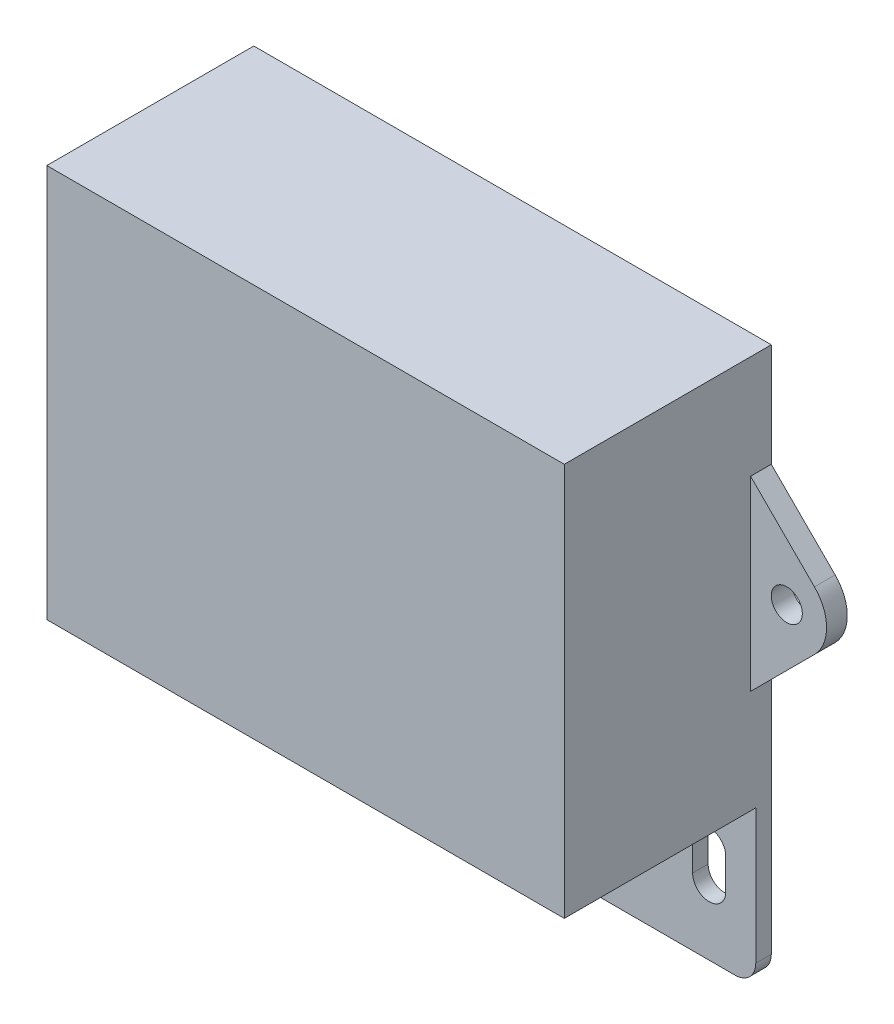
ISO-10303-21;
HEADER;
FILE_DESCRIPTION(('STEP AP214'),'2;1');
FILE_NAME('part.step','',(''),(''),'','','');
FILE_SCHEMA(('AUTOMOTIVE_DESIGN { 1 0 10303 214 1 1 1 1 }'));
ENDSEC;
DATA;
#1=APPLICATION_CONTEXT('core data for automotive mechanical design processes');
#2=APPLICATION_PROTOCOL_DEFINITION('international standard','automotive_design',2000,#1);
#3=PRODUCT_CONTEXT('',#1,'mechanical');
#4=PRODUCT('Part','Part','',(#3));
#5=PRODUCT_RELATED_PRODUCT_CATEGORY('part','',(#4));
#6=PRODUCT_DEFINITION_FORMATION('','',#4);
#7=PRODUCT_DEFINITION_CONTEXT('part definition',#1,'design');
#8=PRODUCT_DEFINITION('design','',#6,#7);
#9=PRODUCT_DEFINITION_SHAPE('','',#8);
#10=(LENGTH_UNIT() NAMED_UNIT(*) SI_UNIT(.MILLI.,.METRE.));
#11=(NAMED_UNIT(*) PLANE_ANGLE_UNIT() SI_UNIT($,.RADIAN.));
#12=(NAMED_UNIT(*) SI_UNIT($,.STERADIAN.) SOLID_ANGLE_UNIT());
#13=UNCERTAINTY_MEASURE_WITH_UNIT(LENGTH_MEASURE(1.E-05),#10,'distance_accuracy_value','');
#14=(GEOMETRIC_REPRESENTATION_CONTEXT(3) GLOBAL_UNCERTAINTY_ASSIGNED_CONTEXT((#13)) GLOBAL_UNIT_ASSIGNED_CONTEXT((#10,
#11,#12)) REPRESENTATION_CONTEXT('',''));
#15=CARTESIAN_POINT('',(0.,0.,0.));
#16=DIRECTION('',(0.,0.,1.));
#17=DIRECTION('',(1.,0.,0.));
#18=AXIS2_PLACEMENT_3D('',#15,#16,#17);
#19=CARTESIAN_POINT('',(-25.,-19.,20.));
#20=DIRECTION('',(0.,1.,0.));
#21=DIRECTION('',(0.,0.,1.));
#22=AXIS2_PLACEMENT_3D('',#19,#20,#21);
#23=PLANE('',#22);
#24=DIRECTION('',(-1.,0.,0.));
#25=VECTOR('',#24,1.);
#26=CARTESIAN_POINT('',(-25.,-19.,1.5));
#27=LINE('',#26,#25);
#28=CARTESIAN_POINT('',(25.,-19.,1.5));
#29=VERTEX_POINT('',#28);
#30=CARTESIAN_POINT('',(-25.,-19.,1.5));
#31=VERTEX_POINT('',#30);
#32=EDGE_CURVE('E295',#29,#31,#27,.T.);
#33=ORIENTED_EDGE('',*,*,#32,.F.);
#34=DIRECTION('',(0.,0.,-1.));
#35=VECTOR('',#34,1.);
#36=CARTESIAN_POINT('',(25.,-19.,20.));
#37=LINE('',#36,#35);
#38=CARTESIAN_POINT('',(25.,-19.,20.));
#39=VERTEX_POINT('',#38);
#40=EDGE_CURVE('E354',#39,#29,#37,.T.);
#41=ORIENTED_EDGE('',*,*,#40,.F.);
#42=DIRECTION('',(1.,0.,0.));
#43=VECTOR('',#42,1.);
#44=CARTESIAN_POINT('',(-25.,-19.,20.));
#45=LINE('',#44,#43);
#46=CARTESIAN_POINT('',(-25.,-19.,20.));
#47=VERTEX_POINT('',#46);
#48=EDGE_CURVE('E352',#47,#39,#45,.T.);
#49=ORIENTED_EDGE('',*,*,#48,.F.);
#50=DIRECTION('',(0.,0.,-1.));
#51=VECTOR('',#50,1.);
#52=CARTESIAN_POINT('',(-25.,-19.,20.));
#53=LINE('',#52,#51);
#54=EDGE_CURVE('E361',#47,#31,#53,.T.);
#55=ORIENTED_EDGE('',*,*,#54,.T.);
#56=EDGE_LOOP('',(#33,#41,#49,#55));
#57=FACE_BOUND('',#56,.T.);
#58=ADVANCED_FACE('F39',(#57),#23,.F.);
#59=CARTESIAN_POINT('',(25.,-19.,20.));
#60=DIRECTION('',(-1.,0.,0.));
#61=DIRECTION('',(0.,0.,1.));
#62=AXIS2_PLACEMENT_3D('',#59,#60,#61);
#63=PLANE('',#62);
#64=DIRECTION('',(0.,1.,0.));
#65=VECTOR('',#64,1.);
#66=CARTESIAN_POINT('',(25.,-19.,0.));
#67=LINE('',#66,#65);
#68=CARTESIAN_POINT('',(25.,-32.,0.));
#69=VERTEX_POINT('',#68);
#70=CARTESIAN_POINT('',(25.,-9.,0.));
#71=VERTEX_POINT('',#70);
#72=EDGE_CURVE('E355',#69,#71,#67,.T.);
#73=ORIENTED_EDGE('',*,*,#72,.T.);
#74=DIRECTION('',(0.,0.,-1.));
#75=VECTOR('',#74,1.);
#76=CARTESIAN_POINT('',(25.,-9.,2.));
#77=LINE('',#76,#75);
#78=CARTESIAN_POINT('',(25.,-9.,2.));
#79=VERTEX_POINT('',#78);
#80=EDGE_CURVE('E262',#79,#71,#77,.T.);
#81=ORIENTED_EDGE('',*,*,#80,.F.);
#82=DIRECTION('',(0.,1.,0.));
#83=VECTOR('',#82,1.);
#84=CARTESIAN_POINT('',(25.,9.,2.));
#85=LINE('',#84,#83);
#86=CARTESIAN_POINT('',(25.,9.,2.));
#87=VERTEX_POINT('',#86);
#88=EDGE_CURVE('E251',#79,#87,#85,.T.);
#89=ORIENTED_EDGE('',*,*,#88,.T.);
#90=DIRECTION('',(0.,0.,-1.));
#91=VECTOR('',#90,1.);
#92=CARTESIAN_POINT('',(25.,9.,2.));
#93=LINE('',#92,#91);
#94=CARTESIAN_POINT('',(25.,9.,0.));
#95=VERTEX_POINT('',#94);
#96=EDGE_CURVE('E258',#87,#95,#93,.T.);
#97=ORIENTED_EDGE('',*,*,#96,.T.);
#98=CARTESIAN_POINT('',(25.,19.,0.));
#99=VERTEX_POINT('',#98);
#100=EDGE_CURVE('E344',#95,#99,#67,.T.);
#101=ORIENTED_EDGE('',*,*,#100,.T.);
#102=DIRECTION('',(0.,0.,-1.));
#103=VECTOR('',#102,1.);
#104=CARTESIAN_POINT('',(25.,19.,20.));
#105=LINE('',#104,#103);
#106=CARTESIAN_POINT('',(25.,19.,20.));
#107=VERTEX_POINT('',#106);
#108=EDGE_CURVE('E367',#107,#99,#105,.T.);
#109=ORIENTED_EDGE('',*,*,#108,.F.);
#110=DIRECTION('',(0.,1.,0.));
#111=VECTOR('',#110,1.);
#112=CARTESIAN_POINT('',(25.,-19.,20.));
#113=LINE('',#112,#111);
#114=EDGE_CURVE('E345',#39,#107,#113,.T.);
#115=ORIENTED_EDGE('',*,*,#114,.F.);
#116=ORIENTED_EDGE('',*,*,#40,.T.);
#117=DIRECTION('',(0.,1.,0.));
#118=VECTOR('',#117,1.);
#119=CARTESIAN_POINT('',(25.,-34.,1.50000000000001));
#120=LINE('',#119,#118);
#121=CARTESIAN_POINT('',(25.,-32.,1.50000000000001));
#122=VERTEX_POINT('',#121);
#123=EDGE_CURVE('E342',#122,#29,#120,.T.);
#124=ORIENTED_EDGE('',*,*,#123,.F.);
#125=DIRECTION('',(0.,0.,1.));
#126=VECTOR('',#125,1.);
#127=CARTESIAN_POINT('',(25.,-32.,0.));
#128=LINE('',#127,#126);
#129=EDGE_CURVE('E380',#122,#69,#128,.F.);
#130=ORIENTED_EDGE('',*,*,#129,.T.);
#131=EDGE_LOOP('',(#73,#81,#89,#97,#101,#109,#115,#116,#124,#130));
#132=FACE_BOUND('',#131,.T.);
#133=ADVANCED_FACE('F408',(#132),#63,.F.);
#134=CARTESIAN_POINT('',(-25.,19.,20.));
#135=DIRECTION('',(0.,-1.,0.));
#136=DIRECTION('',(0.,0.,-1.));
#137=AXIS2_PLACEMENT_3D('',#134,#135,#136);
#138=PLANE('',#137);
#139=DIRECTION('',(-1.,0.,0.));
#140=VECTOR('',#139,1.);
#141=CARTESIAN_POINT('',(-25.,19.,0.));
#142=LINE('',#141,#140);
#143=CARTESIAN_POINT('',(-25.,19.,0.));
#144=VERTEX_POINT('',#143);
#145=EDGE_CURVE('E210',#99,#144,#142,.T.);
#146=ORIENTED_EDGE('',*,*,#145,.T.);
#147=DIRECTION('',(0.,0.,-1.));
#148=VECTOR('',#147,1.);
#149=CARTESIAN_POINT('',(-25.,19.,20.));
#150=LINE('',#149,#148);
#151=CARTESIAN_POINT('',(-25.,19.,20.));
#152=VERTEX_POINT('',#151);
#153=EDGE_CURVE('E364',#152,#144,#150,.T.);
#154=ORIENTED_EDGE('',*,*,#153,.F.);
#155=DIRECTION('',(-1.,0.,0.));
#156=VECTOR('',#155,1.);
#157=CARTESIAN_POINT('',(-25.,19.,20.));
#158=LINE('',#157,#156);
#159=EDGE_CURVE('E348',#107,#152,#158,.T.);
#160=ORIENTED_EDGE('',*,*,#159,.F.);
#161=ORIENTED_EDGE('',*,*,#108,.T.);
#162=EDGE_LOOP('',(#146,#154,#160,#161));
#163=FACE_BOUND('',#162,.T.);
#164=ADVANCED_FACE('F427',(#163),#138,.F.);
#165=CARTESIAN_POINT('',(-25.,-19.,20.));
#166=DIRECTION('',(1.,0.,0.));
#167=DIRECTION('',(0.,0.,-1.));
#168=AXIS2_PLACEMENT_3D('',#165,#166,#167);
#169=PLANE('',#168);
#170=DIRECTION('',(0.,-1.,0.));
#171=VECTOR('',#170,1.);
#172=CARTESIAN_POINT('',(-25.,-19.,0.));
#173=LINE('',#172,#171);
#174=CARTESIAN_POINT('',(-25.,9.,0.));
#175=VERTEX_POINT('',#174);
#176=EDGE_CURVE('E209',#144,#175,#173,.T.);
#177=ORIENTED_EDGE('',*,*,#176,.T.);
#178=DIRECTION('',(0.,0.,-1.));
#179=VECTOR('',#178,1.);
#180=CARTESIAN_POINT('',(-25.,9.,2.));
#181=LINE('',#180,#179);
#182=CARTESIAN_POINT('',(-25.,9.,2.));
#183=VERTEX_POINT('',#182);
#184=EDGE_CURVE('E223',#183,#175,#181,.T.);
#185=ORIENTED_EDGE('',*,*,#184,.F.);
#186=DIRECTION('',(0.,-1.,0.));
#187=VECTOR('',#186,1.);
#188=CARTESIAN_POINT('',(-25.,9.,2.));
#189=LINE('',#188,#187);
#190=CARTESIAN_POINT('',(-25.,-9.,2.));
#191=VERTEX_POINT('',#190);
#192=EDGE_CURVE('E218',#183,#191,#189,.T.);
#193=ORIENTED_EDGE('',*,*,#192,.T.);
#194=DIRECTION('',(0.,0.,-1.));
#195=VECTOR('',#194,1.);
#196=CARTESIAN_POINT('',(-25.,-9.,2.));
#197=LINE('',#196,#195);
#198=CARTESIAN_POINT('',(-25.,-9.,0.));
#199=VERTEX_POINT('',#198);
#200=EDGE_CURVE('E213',#191,#199,#197,.T.);
#201=ORIENTED_EDGE('',*,*,#200,.T.);
#202=CARTESIAN_POINT('',(-25.,-32.,0.));
#203=VERTEX_POINT('',#202);
#204=EDGE_CURVE('E199',#199,#203,#173,.T.);
#205=ORIENTED_EDGE('',*,*,#204,.T.);
#206=DIRECTION('',(0.,0.,-1.));
#207=VECTOR('',#206,1.);
#208=CARTESIAN_POINT('',(-25.,-32.,1.5));
#209=LINE('',#208,#207);
#210=CARTESIAN_POINT('',(-25.,-32.,1.5));
#211=VERTEX_POINT('',#210);
#212=EDGE_CURVE('E385',#203,#211,#209,.F.);
#213=ORIENTED_EDGE('',*,*,#212,.T.);
#214=DIRECTION('',(0.,1.,0.));
#215=VECTOR('',#214,1.);
#216=CARTESIAN_POINT('',(-25.,-34.,1.5));
#217=LINE('',#216,#215);
#218=EDGE_CURVE('E338',#211,#31,#217,.T.);
#219=ORIENTED_EDGE('',*,*,#218,.T.);
#220=ORIENTED_EDGE('',*,*,#54,.F.);
#221=DIRECTION('',(0.,-1.,0.));
#222=VECTOR('',#221,1.);
#223=CARTESIAN_POINT('',(-25.,-19.,20.));
#224=LINE('',#223,#222);
#225=EDGE_CURVE('E350',#152,#47,#224,.T.);
#226=ORIENTED_EDGE('',*,*,#225,.F.);
#227=ORIENTED_EDGE('',*,*,#153,.T.);
#228=EDGE_LOOP('',(#177,#185,#193,#201,#205,#213,#219,#220,#226,#227));
#229=FACE_BOUND('',#228,.T.);
#230=ADVANCED_FACE('F215',(#229),#169,.F.);
#231=CARTESIAN_POINT('',(0.,0.,20.));
#232=DIRECTION('',(0.,0.,-1.));
#233=DIRECTION('',(-1.,0.,0.));
#234=AXIS2_PLACEMENT_3D('',#231,#232,#233);
#235=PLANE('',#234);
#236=ORIENTED_EDGE('',*,*,#114,.T.);
#237=ORIENTED_EDGE('',*,*,#159,.T.);
#238=ORIENTED_EDGE('',*,*,#225,.T.);
#239=ORIENTED_EDGE('',*,*,#48,.T.);
#240=EDGE_LOOP('',(#236,#237,#238,#239));
#241=FACE_BOUND('',#240,.T.);
#242=ADVANCED_FACE('F435',(#241),#235,.F.);
#243=CARTESIAN_POINT('',(0.,0.,0.));
#244=DIRECTION('',(0.,0.,-1.));
#245=DIRECTION('',(-1.,0.,0.));
#246=AXIS2_PLACEMENT_3D('',#243,#244,#245);
#247=PLANE('',#246);
#248=CARTESIAN_POINT('',(-20.5,-27.5,0.));
#249=DIRECTION('',(0.,0.,1.));
#250=DIRECTION('',(1.,0.,0.));
#251=AXIS2_PLACEMENT_3D('',#248,#249,#250);
#252=CIRCLE('',#251,1.6);
#253=CARTESIAN_POINT('',(-22.1,-27.5,0.));
#254=VERTEX_POINT('',#253);
#255=CARTESIAN_POINT('',(-18.9,-27.5,0.));
#256=VERTEX_POINT('',#255);
#257=EDGE_CURVE('E268',#254,#256,#252,.T.);
#258=ORIENTED_EDGE('',*,*,#257,.T.);
#259=DIRECTION('',(0.,1.,0.));
#260=VECTOR('',#259,1.);
#261=CARTESIAN_POINT('',(-18.9,-24.5,0.));
#262=LINE('',#261,#260);
#263=CARTESIAN_POINT('',(-18.9,-24.5,0.));
#264=VERTEX_POINT('',#263);
#265=EDGE_CURVE('E271',#256,#264,#262,.T.);
#266=ORIENTED_EDGE('',*,*,#265,.T.);
#267=CARTESIAN_POINT('',(-20.5,-24.5,0.));
#268=DIRECTION('',(0.,0.,1.));
#269=DIRECTION('',(1.,0.,0.));
#270=AXIS2_PLACEMENT_3D('',#267,#268,#269);
#271=CIRCLE('',#270,1.6);
#272=CARTESIAN_POINT('',(-22.1,-24.5,0.));
#273=VERTEX_POINT('',#272);
#274=EDGE_CURVE('E275',#264,#273,#271,.T.);
#275=ORIENTED_EDGE('',*,*,#274,.T.);
#276=DIRECTION('',(0.,-1.,0.));
#277=VECTOR('',#276,1.);
#278=CARTESIAN_POINT('',(-22.1,-24.5,0.));
#279=LINE('',#278,#277);
#280=EDGE_CURVE('E278',#273,#254,#279,.T.);
#281=ORIENTED_EDGE('',*,*,#280,.T.);
#282=EDGE_LOOP('',(#258,#266,#275,#281));
#283=FACE_BOUND('',#282,.T.);
#284=CARTESIAN_POINT('',(20.5,-27.5,0.));
#285=DIRECTION('',(0.,0.,1.));
#286=DIRECTION('',(1.,0.,0.));
#287=AXIS2_PLACEMENT_3D('',#284,#285,#286);
#288=CIRCLE('',#287,1.6);
#289=CARTESIAN_POINT('',(18.9,-27.5,0.));
#290=VERTEX_POINT('',#289);
#291=CARTESIAN_POINT('',(22.1,-27.5,0.));
#292=VERTEX_POINT('',#291);
#293=EDGE_CURVE('E315',#290,#292,#288,.T.);
#294=ORIENTED_EDGE('',*,*,#293,.T.);
#295=DIRECTION('',(0.,1.,0.));
#296=VECTOR('',#295,1.);
#297=CARTESIAN_POINT('',(22.1,-24.5,0.));
#298=LINE('',#297,#296);
#299=CARTESIAN_POINT('',(22.1,-24.5,0.));
#300=VERTEX_POINT('',#299);
#301=EDGE_CURVE('E327',#292,#300,#298,.T.);
#302=ORIENTED_EDGE('',*,*,#301,.T.);
#303=CARTESIAN_POINT('',(20.5,-24.5,0.));
#304=DIRECTION('',(0.,0.,1.));
#305=DIRECTION('',(1.,0.,0.));
#306=AXIS2_PLACEMENT_3D('',#303,#304,#305);
#307=CIRCLE('',#306,1.6);
#308=CARTESIAN_POINT('',(18.9,-24.5,0.));
#309=VERTEX_POINT('',#308);
#310=EDGE_CURVE('E324',#300,#309,#307,.T.);
#311=ORIENTED_EDGE('',*,*,#310,.T.);
#312=DIRECTION('',(0.,-1.,0.));
#313=VECTOR('',#312,1.);
#314=CARTESIAN_POINT('',(18.9,-24.5,0.));
#315=LINE('',#314,#313);
#316=EDGE_CURVE('E305',#309,#290,#315,.T.);
#317=ORIENTED_EDGE('',*,*,#316,.T.);
#318=EDGE_LOOP('',(#294,#302,#311,#317));
#319=FACE_BOUND('',#318,.T.);
#320=DIRECTION('',(-0.707106781186547,0.707106781186548,0.));
#321=VECTOR('',#320,1.);
#322=CARTESIAN_POINT('',(-25.,-9.,0.));
#323=LINE('',#322,#321);
#324=CARTESIAN_POINT('',(-31.1715728752538,-2.82842712474619,0.));
#325=VERTEX_POINT('',#324);
#326=EDGE_CURVE('E204',#199,#325,#323,.T.);
#327=ORIENTED_EDGE('',*,*,#326,.T.);
#328=CARTESIAN_POINT('',(-28.3431457505076,0.,0.));
#329=DIRECTION('',(0.,0.,-1.));
#330=DIRECTION('',(-1.,0.,0.));
#331=AXIS2_PLACEMENT_3D('',#328,#329,#330);
#332=CIRCLE('',#331,4.);
#333=CARTESIAN_POINT('',(-31.1715728752538,2.82842712474619,0.));
#334=VERTEX_POINT('',#333);
#335=EDGE_CURVE('E390',#325,#334,#332,.T.);
#336=ORIENTED_EDGE('',*,*,#335,.T.);
#337=DIRECTION('',(0.707106781186547,0.707106781186547,0.));
#338=VECTOR('',#337,1.);
#339=CARTESIAN_POINT('',(-34.,0.,0.));
#340=LINE('',#339,#338);
#341=EDGE_CURVE('E230',#334,#175,#340,.T.);
#342=ORIENTED_EDGE('',*,*,#341,.T.);
#343=ORIENTED_EDGE('',*,*,#176,.F.);
#344=ORIENTED_EDGE('',*,*,#145,.F.);
#345=ORIENTED_EDGE('',*,*,#100,.F.);
#346=DIRECTION('',(0.707106781186547,-0.707106781186548,0.));
#347=VECTOR('',#346,1.);
#348=CARTESIAN_POINT('',(25.,9.,0.));
#349=LINE('',#348,#347);
#350=CARTESIAN_POINT('',(31.1715728752538,2.82842712474619,0.));
#351=VERTEX_POINT('',#350);
#352=EDGE_CURVE('E248',#95,#351,#349,.T.);
#353=ORIENTED_EDGE('',*,*,#352,.T.);
#354=CARTESIAN_POINT('',(28.3431457505076,0.,0.));
#355=DIRECTION('',(0.,0.,-1.));
#356=DIRECTION('',(-1.,0.,0.));
#357=AXIS2_PLACEMENT_3D('',#354,#355,#356);
#358=CIRCLE('',#357,4.);
#359=CARTESIAN_POINT('',(31.1715728752538,-2.82842712474619,0.));
#360=VERTEX_POINT('',#359);
#361=EDGE_CURVE('E388',#351,#360,#358,.T.);
#362=ORIENTED_EDGE('',*,*,#361,.T.);
#363=DIRECTION('',(-0.707106781186547,-0.707106781186548,0.));
#364=VECTOR('',#363,1.);
#365=CARTESIAN_POINT('',(34.,0.,0.));
#366=LINE('',#365,#364);
#367=EDGE_CURVE('E254',#360,#71,#366,.T.);
#368=ORIENTED_EDGE('',*,*,#367,.T.);
#369=ORIENTED_EDGE('',*,*,#72,.F.);
#370=CARTESIAN_POINT('',(23.,-32.,0.));
#371=DIRECTION('',(0.,0.,-1.));
#372=DIRECTION('',(-1.,0.,0.));
#373=AXIS2_PLACEMENT_3D('',#370,#371,#372);
#374=CIRCLE('',#373,2.);
#375=CARTESIAN_POINT('',(23.,-34.,0.));
#376=VERTEX_POINT('',#375);
#377=EDGE_CURVE('E383',#69,#376,#374,.T.);
#378=ORIENTED_EDGE('',*,*,#377,.T.);
#379=DIRECTION('',(1.,0.,0.));
#380=VECTOR('',#379,1.);
#381=CARTESIAN_POINT('',(-25.,-34.,0.));
#382=LINE('',#381,#380);
#383=CARTESIAN_POINT('',(-23.,-34.,0.));
#384=VERTEX_POINT('',#383);
#385=EDGE_CURVE('E332',#384,#376,#382,.T.);
#386=ORIENTED_EDGE('',*,*,#385,.F.);
#387=CARTESIAN_POINT('',(-23.,-32.,0.));
#388=DIRECTION('',(0.,0.,-1.));
#389=DIRECTION('',(-1.,0.,0.));
#390=AXIS2_PLACEMENT_3D('',#387,#388,#389);
#391=CIRCLE('',#390,2.);
#392=EDGE_CURVE('E206',#384,#203,#391,.T.);
#393=ORIENTED_EDGE('',*,*,#392,.T.);
#394=ORIENTED_EDGE('',*,*,#204,.F.);
#395=EDGE_LOOP('',(#327,#336,#342,#343,#344,#345,#353,#362,#368,#369,#378,#386,#393,#394));
#396=FACE_BOUND('',#395,.T.);
#397=CARTESIAN_POINT('',(28.5,0.,0.));
#398=DIRECTION('',(0.,0.,-1.));
#399=DIRECTION('',(-1.,0.,0.));
#400=AXIS2_PLACEMENT_3D('',#397,#398,#399);
#401=CIRCLE('',#400,1.5);
#402=CARTESIAN_POINT('',(27.,0.,0.));
#403=VERTEX_POINT('',#402);
#404=EDGE_CURVE('E243',#403,#403,#401,.T.);
#405=ORIENTED_EDGE('',*,*,#404,.F.);
#406=EDGE_LOOP('',(#405));
#407=FACE_BOUND('',#406,.T.);
#408=CARTESIAN_POINT('',(-28.5,0.,0.));
#409=DIRECTION('',(0.,0.,-1.));
#410=DIRECTION('',(-1.,0.,0.));
#411=AXIS2_PLACEMENT_3D('',#408,#409,#410);
#412=CIRCLE('',#411,1.5);
#413=CARTESIAN_POINT('',(-30.,0.,0.));
#414=VERTEX_POINT('',#413);
#415=EDGE_CURVE('E233',#414,#414,#412,.T.);
#416=ORIENTED_EDGE('',*,*,#415,.F.);
#417=EDGE_LOOP('',(#416));
#418=FACE_BOUND('',#417,.T.);
#419=ADVANCED_FACE('F201',(#283,#319,#396,#407,#418),#247,.T.);
#420=CARTESIAN_POINT('',(-25.,-34.,1.5));
#421=DIRECTION('',(0.,0.,-1.));
#422=DIRECTION('',(-1.,0.,0.));
#423=AXIS2_PLACEMENT_3D('',#420,#421,#422);
#424=PLANE('',#423);
#425=DIRECTION('',(0.,1.,0.));
#426=VECTOR('',#425,1.);
#427=CARTESIAN_POINT('',(-18.9,-24.5,1.5));
#428=LINE('',#427,#426);
#429=CARTESIAN_POINT('',(-18.9,-27.5,1.5));
#430=VERTEX_POINT('',#429);
#431=CARTESIAN_POINT('',(-18.9,-24.5,1.5));
#432=VERTEX_POINT('',#431);
#433=EDGE_CURVE('E284',#430,#432,#428,.T.);
#434=ORIENTED_EDGE('',*,*,#433,.F.);
#435=CARTESIAN_POINT('',(-20.5,-27.5,1.5));
#436=DIRECTION('',(0.,0.,1.));
#437=DIRECTION('',(1.,0.,0.));
#438=AXIS2_PLACEMENT_3D('',#435,#436,#437);
#439=CIRCLE('',#438,1.6);
#440=CARTESIAN_POINT('',(-22.1,-27.5,1.5));
#441=VERTEX_POINT('',#440);
#442=EDGE_CURVE('E282',#441,#430,#439,.T.);
#443=ORIENTED_EDGE('',*,*,#442,.F.);
#444=DIRECTION('',(0.,-1.,0.));
#445=VECTOR('',#444,1.);
#446=CARTESIAN_POINT('',(-22.1,-24.5,1.5));
#447=LINE('',#446,#445);
#448=CARTESIAN_POINT('',(-22.1,-24.5,1.5));
#449=VERTEX_POINT('',#448);
#450=EDGE_CURVE('E272',#449,#441,#447,.T.);
#451=ORIENTED_EDGE('',*,*,#450,.F.);
#452=CARTESIAN_POINT('',(-20.5,-24.5,1.5));
#453=DIRECTION('',(0.,0.,1.));
#454=DIRECTION('',(1.,0.,0.));
#455=AXIS2_PLACEMENT_3D('',#452,#453,#454);
#456=CIRCLE('',#455,1.6);
#457=EDGE_CURVE('E288',#432,#449,#456,.T.);
#458=ORIENTED_EDGE('',*,*,#457,.F.);
#459=EDGE_LOOP('',(#434,#443,#451,#458));
#460=FACE_BOUND('',#459,.T.);
#461=DIRECTION('',(0.,1.,0.));
#462=VECTOR('',#461,1.);
#463=CARTESIAN_POINT('',(22.1,-24.5,1.5));
#464=LINE('',#463,#462);
#465=CARTESIAN_POINT('',(22.1,-27.5,1.50000000000001));
#466=VERTEX_POINT('',#465);
#467=CARTESIAN_POINT('',(22.1,-24.5,1.5));
#468=VERTEX_POINT('',#467);
#469=EDGE_CURVE('E318',#466,#468,#464,.T.);
#470=ORIENTED_EDGE('',*,*,#469,.F.);
#471=CARTESIAN_POINT('',(20.5,-27.5,1.5));
#472=DIRECTION('',(0.,0.,1.));
#473=DIRECTION('',(1.,0.,0.));
#474=AXIS2_PLACEMENT_3D('',#471,#472,#473);
#475=CIRCLE('',#474,1.6);
#476=CARTESIAN_POINT('',(18.9,-27.5,1.5));
#477=VERTEX_POINT('',#476);
#478=EDGE_CURVE('E285',#477,#466,#475,.T.);
#479=ORIENTED_EDGE('',*,*,#478,.F.);
#480=DIRECTION('',(0.,-1.,0.));
#481=VECTOR('',#480,1.);
#482=CARTESIAN_POINT('',(18.9,-24.5,1.5));
#483=LINE('',#482,#481);
#484=CARTESIAN_POINT('',(18.9,-24.5,1.5));
#485=VERTEX_POINT('',#484);
#486=EDGE_CURVE('E311',#485,#477,#483,.T.);
#487=ORIENTED_EDGE('',*,*,#486,.F.);
#488=CARTESIAN_POINT('',(20.5,-24.5,1.5));
#489=DIRECTION('',(0.,0.,1.));
#490=DIRECTION('',(1.,0.,0.));
#491=AXIS2_PLACEMENT_3D('',#488,#489,#490);
#492=CIRCLE('',#491,1.6);
#493=EDGE_CURVE('E314',#468,#485,#492,.T.);
#494=ORIENTED_EDGE('',*,*,#493,.F.);
#495=EDGE_LOOP('',(#470,#479,#487,#494));
#496=FACE_BOUND('',#495,.T.);
#497=DIRECTION('',(-1.,0.,0.));
#498=VECTOR('',#497,1.);
#499=CARTESIAN_POINT('',(-25.,-34.,1.5));
#500=LINE('',#499,#498);
#501=CARTESIAN_POINT('',(23.,-34.,1.50000000000001));
#502=VERTEX_POINT('',#501);
#503=CARTESIAN_POINT('',(-23.,-34.,1.5));
#504=VERTEX_POINT('',#503);
#505=EDGE_CURVE('E335',#502,#504,#500,.T.);
#506=ORIENTED_EDGE('',*,*,#505,.F.);
#507=CARTESIAN_POINT('',(23.,-32.,1.50000000000001));
#508=DIRECTION('',(0.,0.,-1.));
#509=DIRECTION('',(-1.,0.,0.));
#510=AXIS2_PLACEMENT_3D('',#507,#508,#509);
#511=CIRCLE('',#510,2.);
#512=EDGE_CURVE('E378',#502,#122,#511,.F.);
#513=ORIENTED_EDGE('',*,*,#512,.T.);
#514=ORIENTED_EDGE('',*,*,#123,.T.);
#515=ORIENTED_EDGE('',*,*,#32,.T.);
#516=ORIENTED_EDGE('',*,*,#218,.F.);
#517=CARTESIAN_POINT('',(-23.,-32.,1.5));
#518=DIRECTION('',(0.,0.,-1.));
#519=DIRECTION('',(-1.,0.,0.));
#520=AXIS2_PLACEMENT_3D('',#517,#518,#519);
#521=CIRCLE('',#520,2.);
#522=EDGE_CURVE('E376',#211,#504,#521,.F.);
#523=ORIENTED_EDGE('',*,*,#522,.T.);
#524=EDGE_LOOP('',(#506,#513,#514,#515,#516,#523));
#525=FACE_BOUND('',#524,.T.);
#526=ADVANCED_FACE('F460',(#460,#496,#525),#424,.F.);
#527=CARTESIAN_POINT('',(0.,-34.,0.));
#528=DIRECTION('',(0.,-1.,0.));
#529=DIRECTION('',(0.,0.,-1.));
#530=AXIS2_PLACEMENT_3D('',#527,#528,#529);
#531=PLANE('',#530);
#532=ORIENTED_EDGE('',*,*,#385,.T.);
#533=DIRECTION('',(0.,0.,1.));
#534=VECTOR('',#533,1.);
#535=CARTESIAN_POINT('',(23.,-34.,1.50000000000001));
#536=LINE('',#535,#534);
#537=EDGE_CURVE('E373',#376,#502,#536,.T.);
#538=ORIENTED_EDGE('',*,*,#537,.T.);
#539=ORIENTED_EDGE('',*,*,#505,.T.);
#540=DIRECTION('',(0.,0.,-1.));
#541=VECTOR('',#540,1.);
#542=CARTESIAN_POINT('',(-23.,-34.,0.));
#543=LINE('',#542,#541);
#544=EDGE_CURVE('E370',#504,#384,#543,.T.);
#545=ORIENTED_EDGE('',*,*,#544,.T.);
#546=EDGE_LOOP('',(#532,#538,#539,#545));
#547=FACE_BOUND('',#546,.T.);
#548=ADVANCED_FACE('F443',(#547),#531,.T.);
#549=CARTESIAN_POINT('',(23.,-32.,0.));
#550=DIRECTION('',(0.,0.,-1.));
#551=DIRECTION('',(-1.,0.,0.));
#552=AXIS2_PLACEMENT_3D('',#549,#550,#551);
#553=CYLINDRICAL_SURFACE('',#552,2.);
#554=ORIENTED_EDGE('',*,*,#377,.F.);
#555=ORIENTED_EDGE('',*,*,#129,.F.);
#556=ORIENTED_EDGE('',*,*,#512,.F.);
#557=ORIENTED_EDGE('',*,*,#537,.F.);
#558=EDGE_LOOP('',(#554,#555,#556,#557));
#559=FACE_BOUND('',#558,.T.);
#560=ADVANCED_FACE('F439',(#559),#553,.T.);
#561=CARTESIAN_POINT('',(-23.,-32.,0.));
#562=DIRECTION('',(0.,0.,1.));
#563=DIRECTION('',(1.,0.,0.));
#564=AXIS2_PLACEMENT_3D('',#561,#562,#563);
#565=CYLINDRICAL_SURFACE('',#564,2.);
#566=ORIENTED_EDGE('',*,*,#522,.F.);
#567=ORIENTED_EDGE('',*,*,#212,.F.);
#568=ORIENTED_EDGE('',*,*,#392,.F.);
#569=ORIENTED_EDGE('',*,*,#544,.F.);
#570=EDGE_LOOP('',(#566,#567,#568,#569));
#571=FACE_BOUND('',#570,.T.);
#572=ADVANCED_FACE('F442',(#571),#565,.T.);
#573=CARTESIAN_POINT('',(20.5,-27.5,0.));
#574=DIRECTION('',(0.,0.,1.));
#575=DIRECTION('',(1.,0.,0.));
#576=AXIS2_PLACEMENT_3D('',#573,#574,#575);
#577=CYLINDRICAL_SURFACE('',#576,1.6);
#578=ORIENTED_EDGE('',*,*,#478,.T.);
#579=DIRECTION('',(0.,0.,1.));
#580=VECTOR('',#579,1.);
#581=CARTESIAN_POINT('',(22.1,-27.5,0.));
#582=LINE('',#581,#580);
#583=EDGE_CURVE('E302',#292,#466,#582,.T.);
#584=ORIENTED_EDGE('',*,*,#583,.F.);
#585=ORIENTED_EDGE('',*,*,#293,.F.);
#586=DIRECTION('',(0.,0.,1.));
#587=VECTOR('',#586,1.);
#588=CARTESIAN_POINT('',(18.9,-27.5,0.));
#589=LINE('',#588,#587);
#590=EDGE_CURVE('E265',#290,#477,#589,.T.);
#591=ORIENTED_EDGE('',*,*,#590,.T.);
#592=EDGE_LOOP('',(#578,#584,#585,#591));
#593=FACE_BOUND('',#592,.T.);
#594=ADVANCED_FACE('F446',(#593),#577,.F.);
#595=CARTESIAN_POINT('',(18.9,-24.5,0.));
#596=DIRECTION('',(-1.,0.,0.));
#597=DIRECTION('',(0.,0.,1.));
#598=AXIS2_PLACEMENT_3D('',#595,#596,#597);
#599=PLANE('',#598);
#600=ORIENTED_EDGE('',*,*,#486,.T.);
#601=ORIENTED_EDGE('',*,*,#590,.F.);
#602=ORIENTED_EDGE('',*,*,#316,.F.);
#603=DIRECTION('',(0.,0.,1.));
#604=VECTOR('',#603,1.);
#605=CARTESIAN_POINT('',(18.9,-24.5,0.));
#606=LINE('',#605,#604);
#607=EDGE_CURVE('E308',#309,#485,#606,.T.);
#608=ORIENTED_EDGE('',*,*,#607,.T.);
#609=EDGE_LOOP('',(#600,#601,#602,#608));
#610=FACE_BOUND('',#609,.T.);
#611=ADVANCED_FACE('F452',(#610),#599,.F.);
#612=CARTESIAN_POINT('',(20.5,-24.5,0.));
#613=DIRECTION('',(0.,0.,1.));
#614=DIRECTION('',(1.,0.,0.));
#615=AXIS2_PLACEMENT_3D('',#612,#613,#614);
#616=CYLINDRICAL_SURFACE('',#615,1.6);
#617=ORIENTED_EDGE('',*,*,#493,.T.);
#618=ORIENTED_EDGE('',*,*,#607,.F.);
#619=ORIENTED_EDGE('',*,*,#310,.F.);
#620=DIRECTION('',(0.,0.,1.));
#621=VECTOR('',#620,1.);
#622=CARTESIAN_POINT('',(22.1,-24.5,0.));
#623=LINE('',#622,#621);
#624=EDGE_CURVE('E306',#300,#468,#623,.T.);
#625=ORIENTED_EDGE('',*,*,#624,.T.);
#626=EDGE_LOOP('',(#617,#618,#619,#625));
#627=FACE_BOUND('',#626,.T.);
#628=ADVANCED_FACE('F484',(#627),#616,.F.);
#629=CARTESIAN_POINT('',(22.1,-24.5,0.));
#630=DIRECTION('',(1.,0.,0.));
#631=DIRECTION('',(0.,0.,-1.));
#632=AXIS2_PLACEMENT_3D('',#629,#630,#631);
#633=PLANE('',#632);
#634=ORIENTED_EDGE('',*,*,#469,.T.);
#635=ORIENTED_EDGE('',*,*,#624,.F.);
#636=ORIENTED_EDGE('',*,*,#301,.F.);
#637=ORIENTED_EDGE('',*,*,#583,.T.);
#638=EDGE_LOOP('',(#634,#635,#636,#637));
#639=FACE_BOUND('',#638,.T.);
#640=ADVANCED_FACE('F488',(#639),#633,.F.);
#641=CARTESIAN_POINT('',(-20.5,-27.5,0.));
#642=DIRECTION('',(0.,0.,1.));
#643=DIRECTION('',(1.,0.,0.));
#644=AXIS2_PLACEMENT_3D('',#641,#642,#643);
#645=CYLINDRICAL_SURFACE('',#644,1.6);
#646=ORIENTED_EDGE('',*,*,#442,.T.);
#647=DIRECTION('',(0.,0.,1.));
#648=VECTOR('',#647,1.);
#649=CARTESIAN_POINT('',(-18.9,-27.5,0.));
#650=LINE('',#649,#648);
#651=EDGE_CURVE('E281',#256,#430,#650,.T.);
#652=ORIENTED_EDGE('',*,*,#651,.F.);
#653=ORIENTED_EDGE('',*,*,#257,.F.);
#654=DIRECTION('',(0.,0.,1.));
#655=VECTOR('',#654,1.);
#656=CARTESIAN_POINT('',(-22.1,-27.5,0.));
#657=LINE('',#656,#655);
#658=EDGE_CURVE('E293',#254,#441,#657,.T.);
#659=ORIENTED_EDGE('',*,*,#658,.T.);
#660=EDGE_LOOP('',(#646,#652,#653,#659));
#661=FACE_BOUND('',#660,.T.);
#662=ADVANCED_FACE('F491',(#661),#645,.F.);
#663=CARTESIAN_POINT('',(-22.1,-24.5,0.));
#664=DIRECTION('',(-1.,0.,0.));
#665=DIRECTION('',(0.,0.,1.));
#666=AXIS2_PLACEMENT_3D('',#663,#664,#665);
#667=PLANE('',#666);
#668=ORIENTED_EDGE('',*,*,#450,.T.);
#669=ORIENTED_EDGE('',*,*,#658,.F.);
#670=ORIENTED_EDGE('',*,*,#280,.F.);
#671=DIRECTION('',(0.,0.,1.));
#672=VECTOR('',#671,1.);
#673=CARTESIAN_POINT('',(-22.1,-24.5,0.));
#674=LINE('',#673,#672);
#675=EDGE_CURVE('E296',#273,#449,#674,.T.);
#676=ORIENTED_EDGE('',*,*,#675,.T.);
#677=EDGE_LOOP('',(#668,#669,#670,#676));
#678=FACE_BOUND('',#677,.T.);
#679=ADVANCED_FACE('F496',(#678),#667,.F.);
#680=CARTESIAN_POINT('',(-20.5,-24.5,0.));
#681=DIRECTION('',(0.,0.,1.));
#682=DIRECTION('',(1.,0.,0.));
#683=AXIS2_PLACEMENT_3D('',#680,#681,#682);
#684=CYLINDRICAL_SURFACE('',#683,1.6);
#685=ORIENTED_EDGE('',*,*,#457,.T.);
#686=ORIENTED_EDGE('',*,*,#675,.F.);
#687=ORIENTED_EDGE('',*,*,#274,.F.);
#688=DIRECTION('',(0.,0.,1.));
#689=VECTOR('',#688,1.);
#690=CARTESIAN_POINT('',(-18.9,-24.5,0.));
#691=LINE('',#690,#689);
#692=EDGE_CURVE('E298',#264,#432,#691,.T.);
#693=ORIENTED_EDGE('',*,*,#692,.T.);
#694=EDGE_LOOP('',(#685,#686,#687,#693));
#695=FACE_BOUND('',#694,.T.);
#696=ADVANCED_FACE('F502',(#695),#684,.F.);
#697=CARTESIAN_POINT('',(-18.9,-24.5,0.));
#698=DIRECTION('',(1.,0.,0.));
#699=DIRECTION('',(0.,0.,-1.));
#700=AXIS2_PLACEMENT_3D('',#697,#698,#699);
#701=PLANE('',#700);
#702=ORIENTED_EDGE('',*,*,#433,.T.);
#703=ORIENTED_EDGE('',*,*,#692,.F.);
#704=ORIENTED_EDGE('',*,*,#265,.F.);
#705=ORIENTED_EDGE('',*,*,#651,.T.);
#706=EDGE_LOOP('',(#702,#703,#704,#705));
#707=FACE_BOUND('',#706,.T.);
#708=ADVANCED_FACE('F498',(#707),#701,.F.);
#709=CARTESIAN_POINT('',(34.,0.,2.));
#710=DIRECTION('',(0.707106781186548,-0.707106781186547,0.));
#711=DIRECTION('',(0.707106781186547,0.707106781186548,0.));
#712=AXIS2_PLACEMENT_3D('',#709,#710,#711);
#713=PLANE('',#712);
#714=ORIENTED_EDGE('',*,*,#367,.F.);
#715=DIRECTION('',(0.,0.,-1.));
#716=VECTOR('',#715,1.);
#717=CARTESIAN_POINT('',(31.1715728752538,-2.82842712474619,2.));
#718=LINE('',#717,#716);
#719=CARTESIAN_POINT('',(31.1715728752538,-2.82842712474619,2.));
#720=VERTEX_POINT('',#719);
#721=EDGE_CURVE('E47',#360,#720,#718,.F.);
#722=ORIENTED_EDGE('',*,*,#721,.T.);
#723=DIRECTION('',(-0.707106781186547,-0.707106781186548,0.));
#724=VECTOR('',#723,1.);
#725=CARTESIAN_POINT('',(34.,0.,2.));
#726=LINE('',#725,#724);
#727=EDGE_CURVE('E256',#720,#79,#726,.T.);
#728=ORIENTED_EDGE('',*,*,#727,.T.);
#729=ORIENTED_EDGE('',*,*,#80,.T.);
#730=EDGE_LOOP('',(#714,#722,#728,#729));
#731=FACE_BOUND('',#730,.T.);
#732=ADVANCED_FACE('F501',(#731),#713,.T.);
#733=CARTESIAN_POINT('',(25.,9.,2.));
#734=DIRECTION('',(0.707106781186548,0.707106781186547,0.));
#735=DIRECTION('',(-0.707106781186547,0.707106781186548,0.));
#736=AXIS2_PLACEMENT_3D('',#733,#734,#735);
#737=PLANE('',#736);
#738=DIRECTION('',(0.707106781186547,-0.707106781186548,0.));
#739=VECTOR('',#738,1.);
#740=CARTESIAN_POINT('',(25.,9.,2.));
#741=LINE('',#740,#739);
#742=CARTESIAN_POINT('',(31.1715728752538,2.82842712474619,2.));
#743=VERTEX_POINT('',#742);
#744=EDGE_CURVE('E253',#87,#743,#741,.T.);
#745=ORIENTED_EDGE('',*,*,#744,.T.);
#746=DIRECTION('',(0.,0.,-1.));
#747=VECTOR('',#746,1.);
#748=CARTESIAN_POINT('',(31.1715728752538,2.82842712474619,2.));
#749=LINE('',#748,#747);
#750=EDGE_CURVE('E396',#743,#351,#749,.T.);
#751=ORIENTED_EDGE('',*,*,#750,.T.);
#752=ORIENTED_EDGE('',*,*,#352,.F.);
#753=ORIENTED_EDGE('',*,*,#96,.F.);
#754=EDGE_LOOP('',(#745,#751,#752,#753));
#755=FACE_BOUND('',#754,.T.);
#756=ADVANCED_FACE('F401',(#755),#737,.T.);
#757=CARTESIAN_POINT('',(0.,0.,2.));
#758=DIRECTION('',(0.,0.,-1.));
#759=DIRECTION('',(-1.,0.,0.));
#760=AXIS2_PLACEMENT_3D('',#757,#758,#759);
#761=PLANE('',#760);
#762=CARTESIAN_POINT('',(28.5,0.,2.));
#763=DIRECTION('',(0.,0.,-1.));
#764=DIRECTION('',(-1.,0.,0.));
#765=AXIS2_PLACEMENT_3D('',#762,#763,#764);
#766=CIRCLE('',#765,1.5);
#767=CARTESIAN_POINT('',(27.,0.,2.));
#768=VERTEX_POINT('',#767);
#769=EDGE_CURVE('E245',#768,#768,#766,.T.);
#770=ORIENTED_EDGE('',*,*,#769,.T.);
#771=EDGE_LOOP('',(#770));
#772=FACE_BOUND('',#771,.T.);
#773=ORIENTED_EDGE('',*,*,#727,.F.);
#774=CARTESIAN_POINT('',(28.3431457505076,0.,2.));
#775=DIRECTION('',(0.,0.,-1.));
#776=DIRECTION('',(-1.,0.,0.));
#777=AXIS2_PLACEMENT_3D('',#774,#775,#776);
#778=CIRCLE('',#777,4.);
#779=EDGE_CURVE('E11',#720,#743,#778,.F.);
#780=ORIENTED_EDGE('',*,*,#779,.T.);
#781=ORIENTED_EDGE('',*,*,#744,.F.);
#782=ORIENTED_EDGE('',*,*,#88,.F.);
#783=EDGE_LOOP('',(#773,#780,#781,#782));
#784=FACE_BOUND('',#783,.T.);
#785=ADVANCED_FACE('F411',(#772,#784),#761,.F.);
#786=CARTESIAN_POINT('',(28.5,0.,2.));
#787=DIRECTION('',(0.,0.,-1.));
#788=DIRECTION('',(-1.,0.,0.));
#789=AXIS2_PLACEMENT_3D('',#786,#787,#788);
#790=CYLINDRICAL_SURFACE('',#789,1.5);
#791=ORIENTED_EDGE('',*,*,#769,.F.);
#792=EDGE_LOOP('',(#791));
#793=FACE_BOUND('',#792,.T.);
#794=ORIENTED_EDGE('',*,*,#404,.T.);
#795=EDGE_LOOP('',(#794));
#796=FACE_BOUND('',#795,.T.);
#797=ADVANCED_FACE('F516',(#793,#796),#790,.F.);
#798=CARTESIAN_POINT('',(-34.,0.,2.));
#799=DIRECTION('',(-0.707106781186547,0.707106781186547,0.));
#800=DIRECTION('',(-0.707106781186548,-0.707106781186548,0.));
#801=AXIS2_PLACEMENT_3D('',#798,#799,#800);
#802=PLANE('',#801);
#803=ORIENTED_EDGE('',*,*,#341,.F.);
#804=DIRECTION('',(0.,0.,-1.));
#805=VECTOR('',#804,1.);
#806=CARTESIAN_POINT('',(-31.1715728752538,2.82842712474619,2.));
#807=LINE('',#806,#805);
#808=CARTESIAN_POINT('',(-31.1715728752538,2.82842712474619,2.));
#809=VERTEX_POINT('',#808);
#810=EDGE_CURVE('E392',#334,#809,#807,.F.);
#811=ORIENTED_EDGE('',*,*,#810,.T.);
#812=DIRECTION('',(0.707106781186547,0.707106781186547,0.));
#813=VECTOR('',#812,1.);
#814=CARTESIAN_POINT('',(-34.,0.,2.));
#815=LINE('',#814,#813);
#816=EDGE_CURVE('E222',#809,#183,#815,.T.);
#817=ORIENTED_EDGE('',*,*,#816,.T.);
#818=ORIENTED_EDGE('',*,*,#184,.T.);
#819=EDGE_LOOP('',(#803,#811,#817,#818));
#820=FACE_BOUND('',#819,.T.);
#821=ADVANCED_FACE('F520',(#820),#802,.T.);
#822=CARTESIAN_POINT('',(-25.,-9.,2.));
#823=DIRECTION('',(-0.707106781186548,-0.707106781186547,0.));
#824=DIRECTION('',(0.707106781186547,-0.707106781186548,0.));
#825=AXIS2_PLACEMENT_3D('',#822,#823,#824);
#826=PLANE('',#825);
#827=DIRECTION('',(-0.707106781186547,0.707106781186548,0.));
#828=VECTOR('',#827,1.);
#829=CARTESIAN_POINT('',(-25.,-9.,2.));
#830=LINE('',#829,#828);
#831=CARTESIAN_POINT('',(-31.1715728752538,-2.82842712474619,2.));
#832=VERTEX_POINT('',#831);
#833=EDGE_CURVE('E239',#191,#832,#830,.T.);
#834=ORIENTED_EDGE('',*,*,#833,.T.);
#835=DIRECTION('',(0.,0.,-1.));
#836=VECTOR('',#835,1.);
#837=CARTESIAN_POINT('',(-31.1715728752538,-2.82842712474619,2.));
#838=LINE('',#837,#836);
#839=EDGE_CURVE('E228',#832,#325,#838,.T.);
#840=ORIENTED_EDGE('',*,*,#839,.T.);
#841=ORIENTED_EDGE('',*,*,#326,.F.);
#842=ORIENTED_EDGE('',*,*,#200,.F.);
#843=EDGE_LOOP('',(#834,#840,#841,#842));
#844=FACE_BOUND('',#843,.T.);
#845=ADVANCED_FACE('F226',(#844),#826,.T.);
#846=CARTESIAN_POINT('',(0.,0.,2.));
#847=DIRECTION('',(0.,0.,-1.));
#848=DIRECTION('',(-1.,0.,0.));
#849=AXIS2_PLACEMENT_3D('',#846,#847,#848);
#850=PLANE('',#849);
#851=CARTESIAN_POINT('',(-28.5,0.,2.));
#852=DIRECTION('',(0.,0.,-1.));
#853=DIRECTION('',(-1.,0.,0.));
#854=AXIS2_PLACEMENT_3D('',#851,#852,#853);
#855=CIRCLE('',#854,1.5);
#856=CARTESIAN_POINT('',(-30.,0.,2.));
#857=VERTEX_POINT('',#856);
#858=EDGE_CURVE('E229',#857,#857,#855,.T.);
#859=ORIENTED_EDGE('',*,*,#858,.T.);
#860=EDGE_LOOP('',(#859));
#861=FACE_BOUND('',#860,.T.);
#862=ORIENTED_EDGE('',*,*,#816,.F.);
#863=CARTESIAN_POINT('',(-28.3431457505076,0.,2.));
#864=DIRECTION('',(0.,0.,-1.));
#865=DIRECTION('',(-1.,0.,0.));
#866=AXIS2_PLACEMENT_3D('',#863,#864,#865);
#867=CIRCLE('',#866,4.);
#868=EDGE_CURVE('E394',#809,#832,#867,.F.);
#869=ORIENTED_EDGE('',*,*,#868,.T.);
#870=ORIENTED_EDGE('',*,*,#833,.F.);
#871=ORIENTED_EDGE('',*,*,#192,.F.);
#872=EDGE_LOOP('',(#862,#869,#870,#871));
#873=FACE_BOUND('',#872,.T.);
#874=ADVANCED_FACE('F524',(#861,#873),#850,.F.);
#875=CARTESIAN_POINT('',(-28.5,0.,2.));
#876=DIRECTION('',(0.,0.,-1.));
#877=DIRECTION('',(-1.,0.,0.));
#878=AXIS2_PLACEMENT_3D('',#875,#876,#877);
#879=CYLINDRICAL_SURFACE('',#878,1.5);
#880=ORIENTED_EDGE('',*,*,#858,.F.);
#881=EDGE_LOOP('',(#880));
#882=FACE_BOUND('',#881,.T.);
#883=ORIENTED_EDGE('',*,*,#415,.T.);
#884=EDGE_LOOP('',(#883));
#885=FACE_BOUND('',#884,.T.);
#886=ADVANCED_FACE('F417',(#882,#885),#879,.F.);
#887=CARTESIAN_POINT('',(-28.3431457505076,0.,2.));
#888=DIRECTION('',(0.,0.,-1.));
#889=DIRECTION('',(-1.,0.,0.));
#890=AXIS2_PLACEMENT_3D('',#887,#888,#889);
#891=CYLINDRICAL_SURFACE('',#890,4.);
#892=ORIENTED_EDGE('',*,*,#868,.F.);
#893=ORIENTED_EDGE('',*,*,#810,.F.);
#894=ORIENTED_EDGE('',*,*,#335,.F.);
#895=ORIENTED_EDGE('',*,*,#839,.F.);
#896=EDGE_LOOP('',(#892,#893,#894,#895));
#897=FACE_BOUND('',#896,.T.);
#898=ADVANCED_FACE('F413',(#897),#891,.T.);
#899=CARTESIAN_POINT('',(28.3431457505076,0.,2.));
#900=DIRECTION('',(0.,0.,-1.));
#901=DIRECTION('',(-1.,0.,0.));
#902=AXIS2_PLACEMENT_3D('',#899,#900,#901);
#903=CYLINDRICAL_SURFACE('',#902,4.);
#904=ORIENTED_EDGE('',*,*,#779,.F.);
#905=ORIENTED_EDGE('',*,*,#721,.F.);
#906=ORIENTED_EDGE('',*,*,#361,.F.);
#907=ORIENTED_EDGE('',*,*,#750,.F.);
#908=EDGE_LOOP('',(#904,#905,#906,#907));
#909=FACE_BOUND('',#908,.T.);
#910=ADVANCED_FACE('F41',(#909),#903,.T.);
#911=CLOSED_SHELL('',(#58,#133,#164,#230,#242,#419,#526,#548,#560,#572,#594,#611,#628,#640,#662,
#679,#696,#708,#732,#756,#785,#797,#821,#845,#874,#886,#898,#910));
#912=MANIFOLD_SOLID_BREP('B2',#911);
#913=ADVANCED_BREP_SHAPE_REPRESENTATION('',(#18,#912),#14);
#914=SHAPE_DEFINITION_REPRESENTATION(#9,#913);
ENDSEC;
END-ISO-10303-21;
